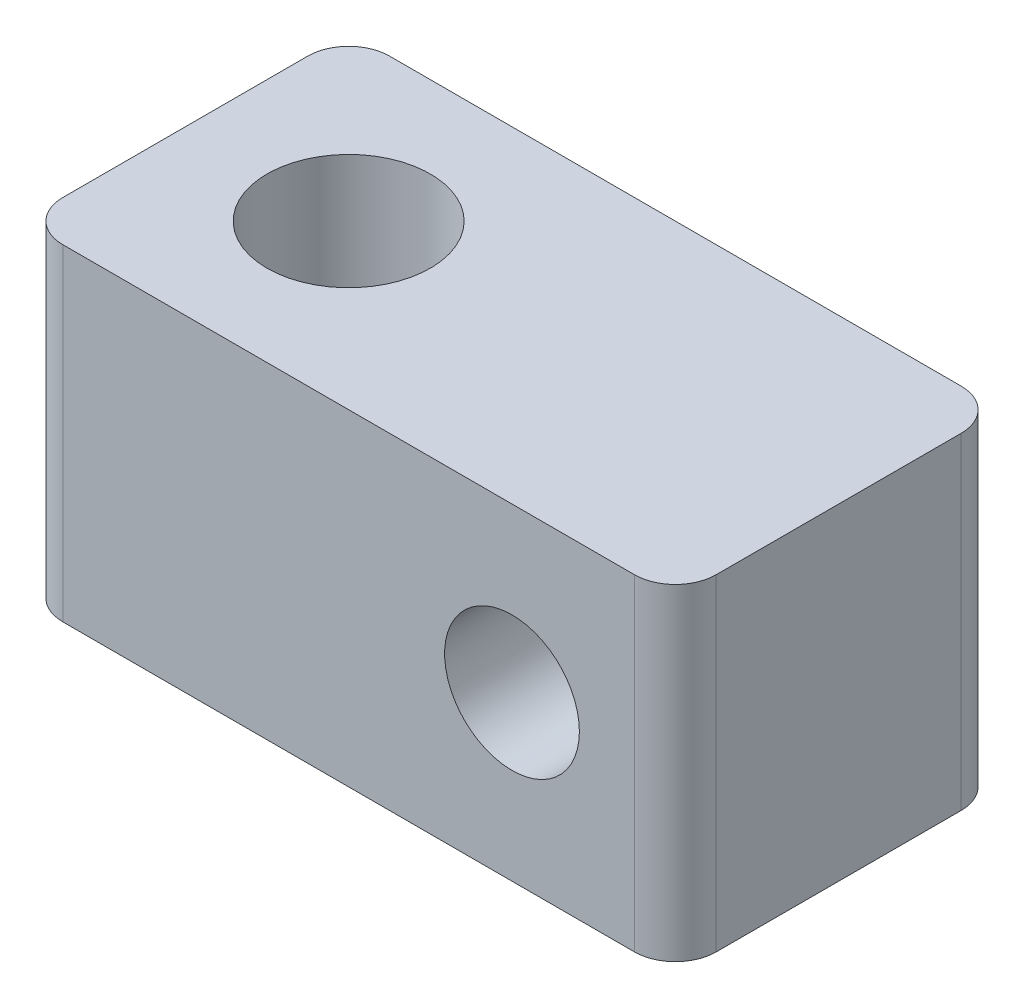
ISO-10303-21;
HEADER;
FILE_DESCRIPTION(('STEP AP214'),'2;1');
FILE_NAME('part.step','',(''),(''),'','','');
FILE_SCHEMA(('AUTOMOTIVE_DESIGN { 1 0 10303 214 1 1 1 1 }'));
ENDSEC;
DATA;
#1=APPLICATION_CONTEXT('core data for automotive mechanical design processes');
#2=APPLICATION_PROTOCOL_DEFINITION('international standard','automotive_design',2000,#1);
#3=PRODUCT_CONTEXT('',#1,'mechanical');
#4=PRODUCT('Part','Part','',(#3));
#5=PRODUCT_RELATED_PRODUCT_CATEGORY('part','',(#4));
#6=PRODUCT_DEFINITION_FORMATION('','',#4);
#7=PRODUCT_DEFINITION_CONTEXT('part definition',#1,'design');
#8=PRODUCT_DEFINITION('design','',#6,#7);
#9=PRODUCT_DEFINITION_SHAPE('','',#8);
#10=(LENGTH_UNIT() NAMED_UNIT(*) SI_UNIT(.MILLI.,.METRE.));
#11=(NAMED_UNIT(*) PLANE_ANGLE_UNIT() SI_UNIT($,.RADIAN.));
#12=(NAMED_UNIT(*) SI_UNIT($,.STERADIAN.) SOLID_ANGLE_UNIT());
#13=UNCERTAINTY_MEASURE_WITH_UNIT(LENGTH_MEASURE(1.E-05),#10,'distance_accuracy_value','');
#14=(GEOMETRIC_REPRESENTATION_CONTEXT(3) GLOBAL_UNCERTAINTY_ASSIGNED_CONTEXT((#13)) GLOBAL_UNIT_ASSIGNED_CONTEXT((#10,
#11,#12)) REPRESENTATION_CONTEXT('',''));
#15=CARTESIAN_POINT('',(0.,0.,0.));
#16=DIRECTION('',(0.,0.,1.));
#17=DIRECTION('',(1.,0.,0.));
#18=AXIS2_PLACEMENT_3D('',#15,#16,#17);
#19=CARTESIAN_POINT('',(8.,8.,-4.));
#20=DIRECTION('',(-1.,0.,0.));
#21=DIRECTION('',(0.,0.,1.));
#22=AXIS2_PLACEMENT_3D('',#19,#20,#21);
#23=PLANE('',#22);
#24=DIRECTION('',(0.,0.,-1.));
#25=VECTOR('',#24,1.);
#26=CARTESIAN_POINT('',(8.,8.,-4.));
#27=LINE('',#26,#25);
#28=CARTESIAN_POINT('',(8.,8.,3.));
#29=VERTEX_POINT('',#28);
#30=CARTESIAN_POINT('',(8.,8.,-3.));
#31=VERTEX_POINT('',#30);
#32=EDGE_CURVE('E124',#29,#31,#27,.T.);
#33=ORIENTED_EDGE('',*,*,#32,.F.);
#34=DIRECTION('',(0.,-1.,0.));
#35=VECTOR('',#34,1.);
#36=CARTESIAN_POINT('',(8.,8.,3.));
#37=LINE('',#36,#35);
#38=CARTESIAN_POINT('',(8.,0.,3.));
#39=VERTEX_POINT('',#38);
#40=EDGE_CURVE('E109',#29,#39,#37,.T.);
#41=ORIENTED_EDGE('',*,*,#40,.T.);
#42=DIRECTION('',(0.,0.,-1.));
#43=VECTOR('',#42,1.);
#44=CARTESIAN_POINT('',(8.,0.,-4.));
#45=LINE('',#44,#43);
#46=CARTESIAN_POINT('',(8.,0.,-3.));
#47=VERTEX_POINT('',#46);
#48=EDGE_CURVE('E121',#39,#47,#45,.T.);
#49=ORIENTED_EDGE('',*,*,#48,.T.);
#50=DIRECTION('',(0.,-1.,0.));
#51=VECTOR('',#50,1.);
#52=CARTESIAN_POINT('',(8.,8.,-3.));
#53=LINE('',#52,#51);
#54=EDGE_CURVE('E126',#47,#31,#53,.F.);
#55=ORIENTED_EDGE('',*,*,#54,.T.);
#56=EDGE_LOOP('',(#33,#41,#49,#55));
#57=FACE_BOUND('',#56,.T.);
#58=ADVANCED_FACE('F38',(#57),#23,.F.);
#59=CARTESIAN_POINT('',(-8.,8.,-4.));
#60=DIRECTION('',(0.,0.,1.));
#61=DIRECTION('',(1.,0.,0.));
#62=AXIS2_PLACEMENT_3D('',#59,#60,#61);
#63=PLANE('',#62);
#64=CARTESIAN_POINT('',(4.,4.,-4.));
#65=DIRECTION('',(0.,0.,1.));
#66=DIRECTION('',(1.,0.,0.));
#67=AXIS2_PLACEMENT_3D('',#64,#65,#66);
#68=CIRCLE('',#67,1.64999999999999);
#69=CARTESIAN_POINT('',(5.64999999999999,4.,-4.));
#70=VERTEX_POINT('',#69);
#71=EDGE_CURVE('E132',#70,#70,#68,.T.);
#72=ORIENTED_EDGE('',*,*,#71,.T.);
#73=EDGE_LOOP('',(#72));
#74=FACE_BOUND('',#73,.T.);
#75=DIRECTION('',(-1.,0.,0.));
#76=VECTOR('',#75,1.);
#77=CARTESIAN_POINT('',(-8.,0.,-4.));
#78=LINE('',#77,#76);
#79=CARTESIAN_POINT('',(7.,0.,-4.));
#80=VERTEX_POINT('',#79);
#81=CARTESIAN_POINT('',(-7.,0.,-4.));
#82=VERTEX_POINT('',#81);
#83=EDGE_CURVE('E131',#80,#82,#78,.T.);
#84=ORIENTED_EDGE('',*,*,#83,.T.);
#85=DIRECTION('',(0.,-1.,0.));
#86=VECTOR('',#85,1.);
#87=CARTESIAN_POINT('',(-7.,8.,-4.));
#88=LINE('',#87,#86);
#89=CARTESIAN_POINT('',(-7.,8.,-4.));
#90=VERTEX_POINT('',#89);
#91=EDGE_CURVE('E11',#82,#90,#88,.F.);
#92=ORIENTED_EDGE('',*,*,#91,.T.);
#93=DIRECTION('',(-1.,0.,0.));
#94=VECTOR('',#93,1.);
#95=CARTESIAN_POINT('',(-8.,8.,-4.));
#96=LINE('',#95,#94);
#97=CARTESIAN_POINT('',(7.,8.,-4.));
#98=VERTEX_POINT('',#97);
#99=EDGE_CURVE('E171',#98,#90,#96,.T.);
#100=ORIENTED_EDGE('',*,*,#99,.F.);
#101=DIRECTION('',(0.,-1.,0.));
#102=VECTOR('',#101,1.);
#103=CARTESIAN_POINT('',(7.,8.,-4.));
#104=LINE('',#103,#102);
#105=EDGE_CURVE('E47',#98,#80,#104,.T.);
#106=ORIENTED_EDGE('',*,*,#105,.T.);
#107=EDGE_LOOP('',(#84,#92,#100,#106));
#108=FACE_BOUND('',#107,.T.);
#109=ADVANCED_FACE('F169',(#74,#108),#63,.F.);
#110=CARTESIAN_POINT('',(-8.,8.,-4.));
#111=DIRECTION('',(1.,0.,0.));
#112=DIRECTION('',(0.,0.,-1.));
#113=AXIS2_PLACEMENT_3D('',#110,#111,#112);
#114=PLANE('',#113);
#115=DIRECTION('',(0.,0.,1.));
#116=VECTOR('',#115,1.);
#117=CARTESIAN_POINT('',(-8.,8.,-4.));
#118=LINE('',#117,#116);
#119=CARTESIAN_POINT('',(-8.,8.,-3.));
#120=VERTEX_POINT('',#119);
#121=CARTESIAN_POINT('',(-8.,8.,3.));
#122=VERTEX_POINT('',#121);
#123=EDGE_CURVE('E179',#120,#122,#118,.T.);
#124=ORIENTED_EDGE('',*,*,#123,.F.);
#125=DIRECTION('',(0.,-1.,0.));
#126=VECTOR('',#125,1.);
#127=CARTESIAN_POINT('',(-8.,8.,-3.));
#128=LINE('',#127,#126);
#129=CARTESIAN_POINT('',(-8.,0.,-3.));
#130=VERTEX_POINT('',#129);
#131=EDGE_CURVE('E162',#120,#130,#128,.T.);
#132=ORIENTED_EDGE('',*,*,#131,.T.);
#133=DIRECTION('',(0.,0.,1.));
#134=VECTOR('',#133,1.);
#135=CARTESIAN_POINT('',(-8.,0.,-4.));
#136=LINE('',#135,#134);
#137=CARTESIAN_POINT('',(-8.,0.,3.));
#138=VERTEX_POINT('',#137);
#139=EDGE_CURVE('E135',#130,#138,#136,.T.);
#140=ORIENTED_EDGE('',*,*,#139,.T.);
#141=DIRECTION('',(0.,-1.,0.));
#142=VECTOR('',#141,1.);
#143=CARTESIAN_POINT('',(-8.,8.,3.));
#144=LINE('',#143,#142);
#145=EDGE_CURVE('E54',#138,#122,#144,.F.);
#146=ORIENTED_EDGE('',*,*,#145,.T.);
#147=EDGE_LOOP('',(#124,#132,#140,#146));
#148=FACE_BOUND('',#147,.T.);
#149=ADVANCED_FACE('F178',(#148),#114,.F.);
#150=CARTESIAN_POINT('',(-8.,8.,4.));
#151=DIRECTION('',(0.,0.,-1.));
#152=DIRECTION('',(-1.,0.,0.));
#153=AXIS2_PLACEMENT_3D('',#150,#151,#152);
#154=PLANE('',#153);
#155=CARTESIAN_POINT('',(4.,4.,4.));
#156=DIRECTION('',(0.,0.,1.));
#157=DIRECTION('',(1.,0.,0.));
#158=AXIS2_PLACEMENT_3D('',#155,#156,#157);
#159=CIRCLE('',#158,1.64999999999999);
#160=CARTESIAN_POINT('',(5.64999999999999,4.,4.));
#161=VERTEX_POINT('',#160);
#162=EDGE_CURVE('E138',#161,#161,#159,.T.);
#163=ORIENTED_EDGE('',*,*,#162,.F.);
#164=EDGE_LOOP('',(#163));
#165=FACE_BOUND('',#164,.T.);
#166=DIRECTION('',(1.,0.,0.));
#167=VECTOR('',#166,1.);
#168=CARTESIAN_POINT('',(-8.,0.,4.));
#169=LINE('',#168,#167);
#170=CARTESIAN_POINT('',(-7.,0.,4.));
#171=VERTEX_POINT('',#170);
#172=CARTESIAN_POINT('',(7.,0.,4.));
#173=VERTEX_POINT('',#172);
#174=EDGE_CURVE('E145',#171,#173,#169,.T.);
#175=ORIENTED_EDGE('',*,*,#174,.T.);
#176=DIRECTION('',(0.,-1.,0.));
#177=VECTOR('',#176,1.);
#178=CARTESIAN_POINT('',(7.,8.,4.));
#179=LINE('',#178,#177);
#180=CARTESIAN_POINT('',(7.,8.,4.));
#181=VERTEX_POINT('',#180);
#182=EDGE_CURVE('E110',#173,#181,#179,.F.);
#183=ORIENTED_EDGE('',*,*,#182,.T.);
#184=DIRECTION('',(1.,0.,0.));
#185=VECTOR('',#184,1.);
#186=CARTESIAN_POINT('',(-8.,8.,4.));
#187=LINE('',#186,#185);
#188=CARTESIAN_POINT('',(-7.,8.,4.));
#189=VERTEX_POINT('',#188);
#190=EDGE_CURVE('E141',#189,#181,#187,.T.);
#191=ORIENTED_EDGE('',*,*,#190,.F.);
#192=DIRECTION('',(0.,-1.,0.));
#193=VECTOR('',#192,1.);
#194=CARTESIAN_POINT('',(-7.,8.,4.));
#195=LINE('',#194,#193);
#196=EDGE_CURVE('E115',#189,#171,#195,.T.);
#197=ORIENTED_EDGE('',*,*,#196,.T.);
#198=EDGE_LOOP('',(#175,#183,#191,#197));
#199=FACE_BOUND('',#198,.T.);
#200=ADVANCED_FACE('F224',(#165,#199),#154,.F.);
#201=CARTESIAN_POINT('',(0.,8.,0.));
#202=DIRECTION('',(0.,1.,0.));
#203=DIRECTION('',(0.,0.,1.));
#204=AXIS2_PLACEMENT_3D('',#201,#202,#203);
#205=PLANE('',#204);
#206=CARTESIAN_POINT('',(-4.,8.,0.));
#207=DIRECTION('',(0.,1.,0.));
#208=DIRECTION('',(0.,0.,1.));
#209=AXIS2_PLACEMENT_3D('',#206,#207,#208);
#210=CIRCLE('',#209,2.);
#211=CARTESIAN_POINT('',(-4.,8.,2.));
#212=VERTEX_POINT('',#211);
#213=EDGE_CURVE('E187',#212,#212,#210,.T.);
#214=ORIENTED_EDGE('',*,*,#213,.F.);
#215=EDGE_LOOP('',(#214));
#216=FACE_BOUND('',#215,.T.);
#217=ORIENTED_EDGE('',*,*,#190,.T.);
#218=CARTESIAN_POINT('',(7.,8.,3.));
#219=DIRECTION('',(0.,1.,0.));
#220=DIRECTION('',(0.,0.,1.));
#221=AXIS2_PLACEMENT_3D('',#218,#219,#220);
#222=CIRCLE('',#221,1.);
#223=EDGE_CURVE('E159',#181,#29,#222,.T.);
#224=ORIENTED_EDGE('',*,*,#223,.T.);
#225=ORIENTED_EDGE('',*,*,#32,.T.);
#226=CARTESIAN_POINT('',(7.,8.,-3.));
#227=DIRECTION('',(0.,1.,0.));
#228=DIRECTION('',(0.,0.,1.));
#229=AXIS2_PLACEMENT_3D('',#226,#227,#228);
#230=CIRCLE('',#229,1.);
#231=EDGE_CURVE('E156',#31,#98,#230,.T.);
#232=ORIENTED_EDGE('',*,*,#231,.T.);
#233=ORIENTED_EDGE('',*,*,#99,.T.);
#234=CARTESIAN_POINT('',(-7.,8.,-3.));
#235=DIRECTION('',(0.,1.,0.));
#236=DIRECTION('',(0.,0.,1.));
#237=AXIS2_PLACEMENT_3D('',#234,#235,#236);
#238=CIRCLE('',#237,1.);
#239=EDGE_CURVE('E61',#90,#120,#238,.T.);
#240=ORIENTED_EDGE('',*,*,#239,.T.);
#241=ORIENTED_EDGE('',*,*,#123,.T.);
#242=CARTESIAN_POINT('',(-7.,8.,3.));
#243=DIRECTION('',(0.,1.,0.));
#244=DIRECTION('',(0.,0.,1.));
#245=AXIS2_PLACEMENT_3D('',#242,#243,#244);
#246=CIRCLE('',#245,1.);
#247=EDGE_CURVE('E154',#122,#189,#246,.T.);
#248=ORIENTED_EDGE('',*,*,#247,.T.);
#249=EDGE_LOOP('',(#217,#224,#225,#232,#233,#240,#241,#248));
#250=FACE_BOUND('',#249,.T.);
#251=ADVANCED_FACE('F220',(#216,#250),#205,.T.);
#252=CARTESIAN_POINT('',(0.,0.,0.));
#253=DIRECTION('',(0.,1.,0.));
#254=DIRECTION('',(0.,0.,1.));
#255=AXIS2_PLACEMENT_3D('',#252,#253,#254);
#256=PLANE('',#255);
#257=CARTESIAN_POINT('',(-4.,0.,0.));
#258=DIRECTION('',(0.,1.,0.));
#259=DIRECTION('',(0.,0.,1.));
#260=AXIS2_PLACEMENT_3D('',#257,#258,#259);
#261=CIRCLE('',#260,2.);
#262=CARTESIAN_POINT('',(-4.,0.,2.));
#263=VERTEX_POINT('',#262);
#264=EDGE_CURVE('E42',#263,#263,#261,.T.);
#265=ORIENTED_EDGE('',*,*,#264,.T.);
#266=EDGE_LOOP('',(#265));
#267=FACE_BOUND('',#266,.T.);
#268=ORIENTED_EDGE('',*,*,#48,.F.);
#269=CARTESIAN_POINT('',(7.,0.,3.));
#270=DIRECTION('',(0.,1.,0.));
#271=DIRECTION('',(0.,0.,1.));
#272=AXIS2_PLACEMENT_3D('',#269,#270,#271);
#273=CIRCLE('',#272,1.);
#274=EDGE_CURVE('E105',#39,#173,#273,.F.);
#275=ORIENTED_EDGE('',*,*,#274,.T.);
#276=ORIENTED_EDGE('',*,*,#174,.F.);
#277=CARTESIAN_POINT('',(-7.,0.,3.));
#278=DIRECTION('',(0.,1.,0.));
#279=DIRECTION('',(0.,0.,1.));
#280=AXIS2_PLACEMENT_3D('',#277,#278,#279);
#281=CIRCLE('',#280,1.);
#282=EDGE_CURVE('E125',#171,#138,#281,.F.);
#283=ORIENTED_EDGE('',*,*,#282,.T.);
#284=ORIENTED_EDGE('',*,*,#139,.F.);
#285=CARTESIAN_POINT('',(-7.,0.,-3.));
#286=DIRECTION('',(0.,1.,0.));
#287=DIRECTION('',(0.,0.,1.));
#288=AXIS2_PLACEMENT_3D('',#285,#286,#287);
#289=CIRCLE('',#288,1.);
#290=EDGE_CURVE('E116',#130,#82,#289,.F.);
#291=ORIENTED_EDGE('',*,*,#290,.T.);
#292=ORIENTED_EDGE('',*,*,#83,.F.);
#293=CARTESIAN_POINT('',(7.,0.,-3.));
#294=DIRECTION('',(0.,1.,0.));
#295=DIRECTION('',(0.,0.,1.));
#296=AXIS2_PLACEMENT_3D('',#293,#294,#295);
#297=CIRCLE('',#296,1.);
#298=EDGE_CURVE('E130',#80,#47,#297,.F.);
#299=ORIENTED_EDGE('',*,*,#298,.T.);
#300=EDGE_LOOP('',(#268,#275,#276,#283,#284,#291,#292,#299));
#301=FACE_BOUND('',#300,.T.);
#302=ADVANCED_FACE('F128',(#267,#301),#256,.F.);
#303=CARTESIAN_POINT('',(4.,4.,4.));
#304=DIRECTION('',(0.,0.,1.));
#305=DIRECTION('',(1.,0.,0.));
#306=AXIS2_PLACEMENT_3D('',#303,#304,#305);
#307=CYLINDRICAL_SURFACE('',#306,1.64999999999999);
#308=ORIENTED_EDGE('',*,*,#162,.T.);
#309=EDGE_LOOP('',(#308));
#310=FACE_BOUND('',#309,.T.);
#311=ORIENTED_EDGE('',*,*,#71,.F.);
#312=EDGE_LOOP('',(#311));
#313=FACE_BOUND('',#312,.T.);
#314=ADVANCED_FACE('F215',(#310,#313),#307,.F.);
#315=CARTESIAN_POINT('',(7.,8.,3.));
#316=DIRECTION('',(0.,-1.,0.));
#317=DIRECTION('',(0.,0.,-1.));
#318=AXIS2_PLACEMENT_3D('',#315,#316,#317);
#319=CYLINDRICAL_SURFACE('',#318,1.);
#320=ORIENTED_EDGE('',*,*,#223,.F.);
#321=ORIENTED_EDGE('',*,*,#182,.F.);
#322=ORIENTED_EDGE('',*,*,#274,.F.);
#323=ORIENTED_EDGE('',*,*,#40,.F.);
#324=EDGE_LOOP('',(#320,#321,#322,#323));
#325=FACE_BOUND('',#324,.T.);
#326=ADVANCED_FACE('F108',(#325),#319,.T.);
#327=CARTESIAN_POINT('',(-7.,8.,-3.));
#328=DIRECTION('',(0.,-1.,0.));
#329=DIRECTION('',(0.,0.,-1.));
#330=AXIS2_PLACEMENT_3D('',#327,#328,#329);
#331=CYLINDRICAL_SURFACE('',#330,1.);
#332=ORIENTED_EDGE('',*,*,#239,.F.);
#333=ORIENTED_EDGE('',*,*,#91,.F.);
#334=ORIENTED_EDGE('',*,*,#290,.F.);
#335=ORIENTED_EDGE('',*,*,#131,.F.);
#336=EDGE_LOOP('',(#332,#333,#334,#335));
#337=FACE_BOUND('',#336,.T.);
#338=ADVANCED_FACE('F177',(#337),#331,.T.);
#339=CARTESIAN_POINT('',(7.,8.,-3.));
#340=DIRECTION('',(0.,-1.,0.));
#341=DIRECTION('',(0.,0.,-1.));
#342=AXIS2_PLACEMENT_3D('',#339,#340,#341);
#343=CYLINDRICAL_SURFACE('',#342,1.);
#344=ORIENTED_EDGE('',*,*,#231,.F.);
#345=ORIENTED_EDGE('',*,*,#54,.F.);
#346=ORIENTED_EDGE('',*,*,#298,.F.);
#347=ORIENTED_EDGE('',*,*,#105,.F.);
#348=EDGE_LOOP('',(#344,#345,#346,#347));
#349=FACE_BOUND('',#348,.T.);
#350=ADVANCED_FACE('F201',(#349),#343,.T.);
#351=CARTESIAN_POINT('',(-7.,8.,3.));
#352=DIRECTION('',(0.,-1.,0.));
#353=DIRECTION('',(0.,0.,-1.));
#354=AXIS2_PLACEMENT_3D('',#351,#352,#353);
#355=CYLINDRICAL_SURFACE('',#354,1.);
#356=ORIENTED_EDGE('',*,*,#247,.F.);
#357=ORIENTED_EDGE('',*,*,#145,.F.);
#358=ORIENTED_EDGE('',*,*,#282,.F.);
#359=ORIENTED_EDGE('',*,*,#196,.F.);
#360=EDGE_LOOP('',(#356,#357,#358,#359));
#361=FACE_BOUND('',#360,.T.);
#362=ADVANCED_FACE('F40',(#361),#355,.T.);
#363=CARTESIAN_POINT('',(-4.,-2.,0.));
#364=DIRECTION('',(0.,1.,0.));
#365=DIRECTION('',(0.,0.,1.));
#366=AXIS2_PLACEMENT_3D('',#363,#364,#365);
#367=CYLINDRICAL_SURFACE('',#366,2.);
#368=ORIENTED_EDGE('',*,*,#213,.T.);
#369=EDGE_LOOP('',(#368));
#370=FACE_BOUND('',#369,.T.);
#371=ORIENTED_EDGE('',*,*,#264,.F.);
#372=EDGE_LOOP('',(#371));
#373=FACE_BOUND('',#372,.T.);
#374=ADVANCED_FACE('F195',(#370,#373),#367,.F.);
#375=CLOSED_SHELL('',(#58,#109,#149,#200,#251,#302,#314,#326,#338,#350,#362,#374));
#376=MANIFOLD_SOLID_BREP('B2',#375);
#377=ADVANCED_BREP_SHAPE_REPRESENTATION('',(#18,#376),#14);
#378=SHAPE_DEFINITION_REPRESENTATION(#9,#377);
ENDSEC;
END-ISO-10303-21;
